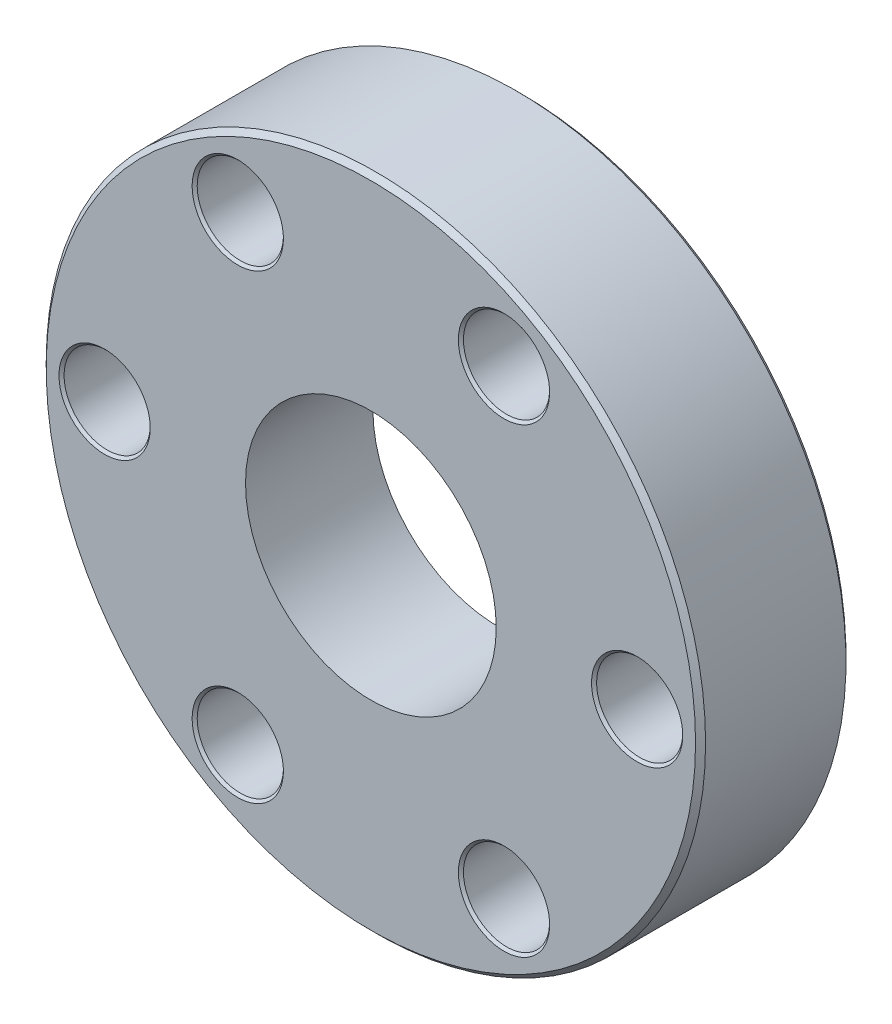
ISO-10303-21;
HEADER;
FILE_DESCRIPTION(('STEP AP214'),'2;1');
FILE_NAME('part.step','',(''),(''),'','','');
FILE_SCHEMA(('AUTOMOTIVE_DESIGN { 1 0 10303 214 1 1 1 1 }'));
ENDSEC;
DATA;
#1=APPLICATION_CONTEXT('core data for automotive mechanical design processes');
#2=APPLICATION_PROTOCOL_DEFINITION('international standard','automotive_design',2000,#1);
#3=PRODUCT_CONTEXT('',#1,'mechanical');
#4=PRODUCT('Part','Part','',(#3));
#5=PRODUCT_RELATED_PRODUCT_CATEGORY('part','',(#4));
#6=PRODUCT_DEFINITION_FORMATION('','',#4);
#7=PRODUCT_DEFINITION_CONTEXT('part definition',#1,'design');
#8=PRODUCT_DEFINITION('design','',#6,#7);
#9=PRODUCT_DEFINITION_SHAPE('','',#8);
#10=(LENGTH_UNIT() NAMED_UNIT(*) SI_UNIT(.MILLI.,.METRE.));
#11=(NAMED_UNIT(*) PLANE_ANGLE_UNIT() SI_UNIT($,.RADIAN.));
#12=(NAMED_UNIT(*) SI_UNIT($,.STERADIAN.) SOLID_ANGLE_UNIT());
#13=UNCERTAINTY_MEASURE_WITH_UNIT(LENGTH_MEASURE(1.E-05),#10,'distance_accuracy_value','');
#14=(GEOMETRIC_REPRESENTATION_CONTEXT(3) GLOBAL_UNCERTAINTY_ASSIGNED_CONTEXT((#13)) GLOBAL_UNIT_ASSIGNED_CONTEXT((#10,
#11,#12)) REPRESENTATION_CONTEXT('',''));
#15=CARTESIAN_POINT('',(0.,0.,0.));
#16=DIRECTION('',(0.,0.,1.));
#17=DIRECTION('',(1.,0.,0.));
#18=AXIS2_PLACEMENT_3D('',#15,#16,#17);
#19=CARTESIAN_POINT('',(0.,0.,0.));
#20=DIRECTION('',(0.,0.,-1.));
#21=DIRECTION('',(-1.,0.,0.));
#22=AXIS2_PLACEMENT_3D('',#19,#20,#21);
#23=CYLINDRICAL_SURFACE('',#22,16.7005);
#24=CARTESIAN_POINT('',(0.,0.,0.254000000000001));
#25=DIRECTION('',(0.,0.,-1.));
#26=DIRECTION('',(-1.,0.,0.));
#27=AXIS2_PLACEMENT_3D('',#24,#25,#26);
#28=CIRCLE('',#27,16.7005);
#29=CARTESIAN_POINT('',(-16.7005,0.,0.254000000000001));
#30=VERTEX_POINT('',#29);
#31=EDGE_CURVE('E37',#30,#30,#28,.F.);
#32=ORIENTED_EDGE('',*,*,#31,.T.);
#33=EDGE_LOOP('',(#32));
#34=FACE_BOUND('',#33,.T.);
#35=CARTESIAN_POINT('',(0.,0.,7.366));
#36=DIRECTION('',(0.,0.,1.));
#37=DIRECTION('',(1.,0.,0.));
#38=AXIS2_PLACEMENT_3D('',#35,#36,#37);
#39=CIRCLE('',#38,16.7005);
#40=CARTESIAN_POINT('',(16.7005,0.,7.366));
#41=VERTEX_POINT('',#40);
#42=EDGE_CURVE('E41',#41,#41,#39,.F.);
#43=ORIENTED_EDGE('',*,*,#42,.T.);
#44=EDGE_LOOP('',(#43));
#45=FACE_BOUND('',#44,.T.);
#46=ADVANCED_FACE('F30',(#34,#45),#23,.T.);
#47=CARTESIAN_POINT('',(0.,6.35,7.61999999999999));
#48=DIRECTION('',(0.,0.,1.));
#49=DIRECTION('',(1.,0.,0.));
#50=AXIS2_PLACEMENT_3D('',#47,#48,#49);
#51=PLANE('',#50);
#52=CARTESIAN_POINT('',(6.74370000000014,-11.6804310310022,7.62));
#53=DIRECTION('',(0.,0.,-1.));
#54=DIRECTION('',(-1.,0.,0.));
#55=AXIS2_PLACEMENT_3D('',#52,#53,#54);
#56=CIRCLE('',#55,2.3114);
#57=CARTESIAN_POINT('',(4.43230000000014,-11.6804310310022,7.62));
#58=VERTEX_POINT('',#57);
#59=EDGE_CURVE('E137',#58,#58,#56,.T.);
#60=ORIENTED_EDGE('',*,*,#59,.T.);
#61=EDGE_LOOP('',(#60));
#62=FACE_BOUND('',#61,.T.);
#63=CARTESIAN_POINT('',(-6.74369999999989,-11.6804310310023,7.62));
#64=DIRECTION('',(0.,0.,-1.));
#65=DIRECTION('',(-1.,0.,0.));
#66=AXIS2_PLACEMENT_3D('',#63,#64,#65);
#67=CIRCLE('',#66,2.3114);
#68=CARTESIAN_POINT('',(-9.05509999999989,-11.6804310310023,7.62));
#69=VERTEX_POINT('',#68);
#70=EDGE_CURVE('E125',#69,#69,#67,.T.);
#71=ORIENTED_EDGE('',*,*,#70,.T.);
#72=EDGE_LOOP('',(#71));
#73=FACE_BOUND('',#72,.T.);
#74=CARTESIAN_POINT('',(-13.4874,0.,7.62));
#75=DIRECTION('',(0.,0.,-1.));
#76=DIRECTION('',(-1.,0.,0.));
#77=AXIS2_PLACEMENT_3D('',#74,#75,#76);
#78=CIRCLE('',#77,2.3114);
#79=CARTESIAN_POINT('',(-15.7988,0.,7.62));
#80=VERTEX_POINT('',#79);
#81=EDGE_CURVE('E113',#80,#80,#78,.T.);
#82=ORIENTED_EDGE('',*,*,#81,.T.);
#83=EDGE_LOOP('',(#82));
#84=FACE_BOUND('',#83,.T.);
#85=CARTESIAN_POINT('',(-6.74370000000006,11.6804310310022,7.62));
#86=DIRECTION('',(0.,0.,-1.));
#87=DIRECTION('',(-1.,0.,0.));
#88=AXIS2_PLACEMENT_3D('',#85,#86,#87);
#89=CIRCLE('',#88,2.3114);
#90=CARTESIAN_POINT('',(-9.05510000000005,11.6804310310022,7.62));
#91=VERTEX_POINT('',#90);
#92=EDGE_CURVE('E101',#91,#91,#89,.T.);
#93=ORIENTED_EDGE('',*,*,#92,.T.);
#94=EDGE_LOOP('',(#93));
#95=FACE_BOUND('',#94,.T.);
#96=CARTESIAN_POINT('',(6.74369999999997,11.6804310310023,7.62));
#97=DIRECTION('',(0.,0.,-1.));
#98=DIRECTION('',(-1.,0.,0.));
#99=AXIS2_PLACEMENT_3D('',#96,#97,#98);
#100=CIRCLE('',#99,2.3114);
#101=CARTESIAN_POINT('',(4.43229999999997,11.6804310310023,7.62));
#102=VERTEX_POINT('',#101);
#103=EDGE_CURVE('E89',#102,#102,#100,.T.);
#104=ORIENTED_EDGE('',*,*,#103,.T.);
#105=EDGE_LOOP('',(#104));
#106=FACE_BOUND('',#105,.T.);
#107=CARTESIAN_POINT('',(13.4874,0.,7.62));
#108=DIRECTION('',(0.,0.,-1.));
#109=DIRECTION('',(-1.,0.,0.));
#110=AXIS2_PLACEMENT_3D('',#107,#108,#109);
#111=CIRCLE('',#110,2.3114);
#112=CARTESIAN_POINT('',(11.176,0.,7.62));
#113=VERTEX_POINT('',#112);
#114=EDGE_CURVE('E77',#113,#113,#111,.T.);
#115=ORIENTED_EDGE('',*,*,#114,.T.);
#116=EDGE_LOOP('',(#115));
#117=FACE_BOUND('',#116,.T.);
#118=CARTESIAN_POINT('',(0.,0.,7.61999999999999));
#119=DIRECTION('',(0.,0.,1.));
#120=DIRECTION('',(1.,0.,0.));
#121=AXIS2_PLACEMENT_3D('',#118,#119,#120);
#122=CIRCLE('',#121,16.4465);
#123=CARTESIAN_POINT('',(16.4465,0.,7.61999999999999));
#124=VERTEX_POINT('',#123);
#125=EDGE_CURVE('E10',#124,#124,#122,.T.);
#126=ORIENTED_EDGE('',*,*,#125,.T.);
#127=EDGE_LOOP('',(#126));
#128=FACE_BOUND('',#127,.T.);
#129=CARTESIAN_POINT('',(0.,0.,7.61999999999999));
#130=DIRECTION('',(0.,0.,-1.));
#131=DIRECTION('',(-1.,0.,0.));
#132=AXIS2_PLACEMENT_3D('',#129,#130,#131);
#133=CIRCLE('',#132,6.35);
#134=CARTESIAN_POINT('',(-6.35,0.,7.61999999999999));
#135=VERTEX_POINT('',#134);
#136=EDGE_CURVE('E50',#135,#135,#133,.T.);
#137=ORIENTED_EDGE('',*,*,#136,.T.);
#138=EDGE_LOOP('',(#137));
#139=FACE_BOUND('',#138,.T.);
#140=ADVANCED_FACE('F141',(#62,#73,#84,#95,#106,#117,#128,#139),#51,.T.);
#141=CARTESIAN_POINT('',(0.,0.,0.));
#142=DIRECTION('',(0.,0.,-1.));
#143=DIRECTION('',(-1.,0.,0.));
#144=AXIS2_PLACEMENT_3D('',#141,#142,#143);
#145=CYLINDRICAL_SURFACE('',#144,6.35);
#146=CARTESIAN_POINT('',(0.,0.,1.1684));
#147=DIRECTION('',(0.,0.,-1.));
#148=DIRECTION('',(-1.,0.,0.));
#149=AXIS2_PLACEMENT_3D('',#146,#147,#148);
#150=CIRCLE('',#149,6.35);
#151=CARTESIAN_POINT('',(-6.35,0.,1.1684));
#152=VERTEX_POINT('',#151);
#153=EDGE_CURVE('E53',#152,#152,#150,.T.);
#154=ORIENTED_EDGE('',*,*,#153,.T.);
#155=EDGE_LOOP('',(#154));
#156=FACE_BOUND('',#155,.T.);
#157=ORIENTED_EDGE('',*,*,#136,.F.);
#158=EDGE_LOOP('',(#157));
#159=FACE_BOUND('',#158,.T.);
#160=ADVANCED_FACE('F203',(#156,#159),#145,.F.);
#161=CARTESIAN_POINT('',(0.,9.017,1.1684));
#162=DIRECTION('',(0.,0.,-1.));
#163=DIRECTION('',(-1.,0.,0.));
#164=AXIS2_PLACEMENT_3D('',#161,#162,#163);
#165=PLANE('',#164);
#166=CARTESIAN_POINT('',(0.,0.,1.1684));
#167=DIRECTION('',(0.,0.,-1.));
#168=DIRECTION('',(-1.,0.,0.));
#169=AXIS2_PLACEMENT_3D('',#166,#167,#168);
#170=CIRCLE('',#169,9.017);
#171=CARTESIAN_POINT('',(-9.017,0.,1.1684));
#172=VERTEX_POINT('',#171);
#173=EDGE_CURVE('E56',#172,#172,#170,.T.);
#174=ORIENTED_EDGE('',*,*,#173,.T.);
#175=EDGE_LOOP('',(#174));
#176=FACE_BOUND('',#175,.T.);
#177=ORIENTED_EDGE('',*,*,#153,.F.);
#178=EDGE_LOOP('',(#177));
#179=FACE_BOUND('',#178,.T.);
#180=ADVANCED_FACE('F197',(#176,#179),#165,.T.);
#181=CARTESIAN_POINT('',(0.,0.,0.));
#182=DIRECTION('',(0.,0.,-1.));
#183=DIRECTION('',(-1.,0.,0.));
#184=AXIS2_PLACEMENT_3D('',#181,#182,#183);
#185=CYLINDRICAL_SURFACE('',#184,9.017);
#186=CARTESIAN_POINT('',(0.,0.,0.660399999999996));
#187=DIRECTION('',(0.,0.,-1.));
#188=DIRECTION('',(-1.,0.,0.));
#189=AXIS2_PLACEMENT_3D('',#186,#187,#188);
#190=CIRCLE('',#189,9.017);
#191=CARTESIAN_POINT('',(-9.017,0.,0.660399999999996));
#192=VERTEX_POINT('',#191);
#193=EDGE_CURVE('E59',#192,#192,#190,.T.);
#194=ORIENTED_EDGE('',*,*,#193,.T.);
#195=EDGE_LOOP('',(#194));
#196=FACE_BOUND('',#195,.T.);
#197=ORIENTED_EDGE('',*,*,#173,.F.);
#198=EDGE_LOOP('',(#197));
#199=FACE_BOUND('',#198,.T.);
#200=ADVANCED_FACE('F191',(#196,#199),#185,.F.);
#201=CARTESIAN_POINT('',(0.,0.,0.660399999999996));
#202=DIRECTION('',(0.,0.,1.));
#203=DIRECTION('',(1.,0.,0.));
#204=AXIS2_PLACEMENT_3D('',#201,#202,#203);
#205=CONICAL_SURFACE('',#204,9.017,1.39626340159546);
#206=CARTESIAN_POINT('',(0.,0.,0.973909371699648));
#207=DIRECTION('',(0.,0.,-1.));
#208=DIRECTION('',(-1.,0.,0.));
#209=AXIS2_PLACEMENT_3D('',#206,#207,#208);
#210=CIRCLE('',#209,10.795);
#211=CARTESIAN_POINT('',(-10.795,0.,0.973909371699648));
#212=VERTEX_POINT('',#211);
#213=EDGE_CURVE('E62',#212,#212,#210,.T.);
#214=ORIENTED_EDGE('',*,*,#213,.T.);
#215=EDGE_LOOP('',(#214));
#216=FACE_BOUND('',#215,.T.);
#217=ORIENTED_EDGE('',*,*,#193,.F.);
#218=EDGE_LOOP('',(#217));
#219=FACE_BOUND('',#218,.T.);
#220=ADVANCED_FACE('F185',(#216,#219),#205,.T.);
#221=CARTESIAN_POINT('',(0.,0.,0.));
#222=DIRECTION('',(0.,0.,-1.));
#223=DIRECTION('',(-1.,0.,0.));
#224=AXIS2_PLACEMENT_3D('',#221,#222,#223);
#225=CYLINDRICAL_SURFACE('',#224,10.795);
#226=CARTESIAN_POINT('',(0.,0.,0.));
#227=DIRECTION('',(0.,0.,-1.));
#228=DIRECTION('',(-1.,0.,0.));
#229=AXIS2_PLACEMENT_3D('',#226,#227,#228);
#230=CIRCLE('',#229,10.795);
#231=CARTESIAN_POINT('',(-10.795,0.,0.));
#232=VERTEX_POINT('',#231);
#233=EDGE_CURVE('E65',#232,#232,#230,.T.);
#234=ORIENTED_EDGE('',*,*,#233,.T.);
#235=EDGE_LOOP('',(#234));
#236=FACE_BOUND('',#235,.T.);
#237=ORIENTED_EDGE('',*,*,#213,.F.);
#238=EDGE_LOOP('',(#237));
#239=FACE_BOUND('',#238,.T.);
#240=ADVANCED_FACE('F167',(#236,#239),#225,.F.);
#241=CARTESIAN_POINT('',(0.,16.7005,0.));
#242=DIRECTION('',(0.,0.,-1.));
#243=DIRECTION('',(-1.,0.,0.));
#244=AXIS2_PLACEMENT_3D('',#241,#242,#243);
#245=PLANE('',#244);
#246=CARTESIAN_POINT('',(6.74370000000014,-11.6804310310022,0.));
#247=DIRECTION('',(0.,0.,-1.));
#248=DIRECTION('',(-1.,0.,0.));
#249=AXIS2_PLACEMENT_3D('',#246,#247,#248);
#250=CIRCLE('',#249,2.3114);
#251=CARTESIAN_POINT('',(4.43230000000014,-11.6804310310022,0.));
#252=VERTEX_POINT('',#251);
#253=EDGE_CURVE('E128',#252,#252,#250,.T.);
#254=ORIENTED_EDGE('',*,*,#253,.F.);
#255=EDGE_LOOP('',(#254));
#256=FACE_BOUND('',#255,.T.);
#257=CARTESIAN_POINT('',(-6.74369999999989,-11.6804310310023,0.));
#258=DIRECTION('',(0.,0.,-1.));
#259=DIRECTION('',(-1.,0.,0.));
#260=AXIS2_PLACEMENT_3D('',#257,#258,#259);
#261=CIRCLE('',#260,2.3114);
#262=CARTESIAN_POINT('',(-9.05509999999989,-11.6804310310023,0.));
#263=VERTEX_POINT('',#262);
#264=EDGE_CURVE('E116',#263,#263,#261,.T.);
#265=ORIENTED_EDGE('',*,*,#264,.F.);
#266=EDGE_LOOP('',(#265));
#267=FACE_BOUND('',#266,.T.);
#268=CARTESIAN_POINT('',(-13.4874,0.,0.));
#269=DIRECTION('',(0.,0.,-1.));
#270=DIRECTION('',(-1.,0.,0.));
#271=AXIS2_PLACEMENT_3D('',#268,#269,#270);
#272=CIRCLE('',#271,2.3114);
#273=CARTESIAN_POINT('',(-15.7988,0.,0.));
#274=VERTEX_POINT('',#273);
#275=EDGE_CURVE('E104',#274,#274,#272,.T.);
#276=ORIENTED_EDGE('',*,*,#275,.F.);
#277=EDGE_LOOP('',(#276));
#278=FACE_BOUND('',#277,.T.);
#279=CARTESIAN_POINT('',(-6.74370000000006,11.6804310310022,0.));
#280=DIRECTION('',(0.,0.,-1.));
#281=DIRECTION('',(-1.,0.,0.));
#282=AXIS2_PLACEMENT_3D('',#279,#280,#281);
#283=CIRCLE('',#282,2.3114);
#284=CARTESIAN_POINT('',(-9.05510000000006,11.6804310310022,0.));
#285=VERTEX_POINT('',#284);
#286=EDGE_CURVE('E92',#285,#285,#283,.T.);
#287=ORIENTED_EDGE('',*,*,#286,.F.);
#288=EDGE_LOOP('',(#287));
#289=FACE_BOUND('',#288,.T.);
#290=CARTESIAN_POINT('',(6.74369999999997,11.6804310310023,0.));
#291=DIRECTION('',(0.,0.,-1.));
#292=DIRECTION('',(-1.,0.,0.));
#293=AXIS2_PLACEMENT_3D('',#290,#291,#292);
#294=CIRCLE('',#293,2.3114);
#295=CARTESIAN_POINT('',(4.43229999999997,11.6804310310023,0.));
#296=VERTEX_POINT('',#295);
#297=EDGE_CURVE('E80',#296,#296,#294,.T.);
#298=ORIENTED_EDGE('',*,*,#297,.F.);
#299=EDGE_LOOP('',(#298));
#300=FACE_BOUND('',#299,.T.);
#301=CARTESIAN_POINT('',(13.4874,0.,0.));
#302=DIRECTION('',(0.,0.,-1.));
#303=DIRECTION('',(-1.,0.,0.));
#304=AXIS2_PLACEMENT_3D('',#301,#302,#303);
#305=CIRCLE('',#304,2.3114);
#306=CARTESIAN_POINT('',(11.176,0.,0.));
#307=VERTEX_POINT('',#306);
#308=EDGE_CURVE('E68',#307,#307,#305,.T.);
#309=ORIENTED_EDGE('',*,*,#308,.F.);
#310=EDGE_LOOP('',(#309));
#311=FACE_BOUND('',#310,.T.);
#312=CARTESIAN_POINT('',(0.,0.,0.));
#313=DIRECTION('',(0.,0.,-1.));
#314=DIRECTION('',(-1.,0.,0.));
#315=AXIS2_PLACEMENT_3D('',#312,#313,#314);
#316=CIRCLE('',#315,16.4465);
#317=CARTESIAN_POINT('',(-16.4465,0.,0.));
#318=VERTEX_POINT('',#317);
#319=EDGE_CURVE('E45',#318,#318,#316,.T.);
#320=ORIENTED_EDGE('',*,*,#319,.T.);
#321=EDGE_LOOP('',(#320));
#322=FACE_BOUND('',#321,.T.);
#323=ORIENTED_EDGE('',*,*,#233,.F.);
#324=EDGE_LOOP('',(#323));
#325=FACE_BOUND('',#324,.T.);
#326=ADVANCED_FACE('F163',(#256,#267,#278,#289,#300,#311,#322,#325),#245,.T.);
#327=CARTESIAN_POINT('',(0.,0.,0.));
#328=DIRECTION('',(0.,0.,1.));
#329=DIRECTION('',(1.,0.,0.));
#330=AXIS2_PLACEMENT_3D('',#327,#328,#329);
#331=CONICAL_SURFACE('',#330,16.4465,0.785398163397462);
#332=ORIENTED_EDGE('',*,*,#31,.F.);
#333=EDGE_LOOP('',(#332));
#334=FACE_BOUND('',#333,.T.);
#335=ORIENTED_EDGE('',*,*,#319,.F.);
#336=EDGE_LOOP('',(#335));
#337=FACE_BOUND('',#336,.T.);
#338=ADVANCED_FACE('F166',(#334,#337),#331,.T.);
#339=CARTESIAN_POINT('',(0.,0.,7.366));
#340=DIRECTION('',(0.,0.,-1.));
#341=DIRECTION('',(-1.,0.,0.));
#342=AXIS2_PLACEMENT_3D('',#339,#340,#341);
#343=CONICAL_SURFACE('',#342,16.7005,0.785398163397455);
#344=ORIENTED_EDGE('',*,*,#125,.F.);
#345=EDGE_LOOP('',(#344));
#346=FACE_BOUND('',#345,.T.);
#347=ORIENTED_EDGE('',*,*,#42,.F.);
#348=EDGE_LOOP('',(#347));
#349=FACE_BOUND('',#348,.T.);
#350=ADVANCED_FACE('F32',(#346,#349),#343,.T.);
#351=CARTESIAN_POINT('',(13.4874,0.,0.));
#352=DIRECTION('',(0.,0.,-1.));
#353=DIRECTION('',(-1.,0.,0.));
#354=AXIS2_PLACEMENT_3D('',#351,#352,#353);
#355=CONICAL_SURFACE('',#354,2.3114,0.785398163397458);
#356=CARTESIAN_POINT('',(13.4874,0.,0.128523999999999));
#357=DIRECTION('',(0.,0.,-1.));
#358=DIRECTION('',(-1.,0.,0.));
#359=AXIS2_PLACEMENT_3D('',#356,#357,#358);
#360=CIRCLE('',#359,2.182876);
#361=CARTESIAN_POINT('',(11.304524,0.,0.128523999999999));
#362=VERTEX_POINT('',#361);
#363=EDGE_CURVE('E71',#362,#362,#360,.T.);
#364=ORIENTED_EDGE('',*,*,#363,.F.);
#365=EDGE_LOOP('',(#364));
#366=FACE_BOUND('',#365,.T.);
#367=ORIENTED_EDGE('',*,*,#308,.T.);
#368=EDGE_LOOP('',(#367));
#369=FACE_BOUND('',#368,.T.);
#370=ADVANCED_FACE('F223',(#366,#369),#355,.F.);
#371=CARTESIAN_POINT('',(13.4874,0.,0.));
#372=DIRECTION('',(0.,0.,-1.));
#373=DIRECTION('',(-1.,0.,0.));
#374=AXIS2_PLACEMENT_3D('',#371,#372,#373);
#375=CYLINDRICAL_SURFACE('',#374,2.182876);
#376=CARTESIAN_POINT('',(13.4874,0.,7.491476));
#377=DIRECTION('',(0.,0.,-1.));
#378=DIRECTION('',(-1.,0.,0.));
#379=AXIS2_PLACEMENT_3D('',#376,#377,#378);
#380=CIRCLE('',#379,2.182876);
#381=CARTESIAN_POINT('',(11.304524,0.,7.491476));
#382=VERTEX_POINT('',#381);
#383=EDGE_CURVE('E74',#382,#382,#380,.T.);
#384=ORIENTED_EDGE('',*,*,#383,.F.);
#385=EDGE_LOOP('',(#384));
#386=FACE_BOUND('',#385,.T.);
#387=ORIENTED_EDGE('',*,*,#363,.T.);
#388=EDGE_LOOP('',(#387));
#389=FACE_BOUND('',#388,.T.);
#390=ADVANCED_FACE('F229',(#386,#389),#375,.F.);
#391=CARTESIAN_POINT('',(13.4874,0.,7.491476));
#392=DIRECTION('',(0.,0.,1.));
#393=DIRECTION('',(1.,0.,0.));
#394=AXIS2_PLACEMENT_3D('',#391,#392,#393);
#395=CONICAL_SURFACE('',#394,2.182876,0.785398163397445);
#396=ORIENTED_EDGE('',*,*,#114,.F.);
#397=EDGE_LOOP('',(#396));
#398=FACE_BOUND('',#397,.T.);
#399=ORIENTED_EDGE('',*,*,#383,.T.);
#400=EDGE_LOOP('',(#399));
#401=FACE_BOUND('',#400,.T.);
#402=ADVANCED_FACE('F238',(#398,#401),#395,.F.);
#403=CARTESIAN_POINT('',(6.74369999999997,11.6804310310023,0.));
#404=DIRECTION('',(0.,0.,-1.));
#405=DIRECTION('',(-1.,0.,0.));
#406=AXIS2_PLACEMENT_3D('',#403,#404,#405);
#407=CONICAL_SURFACE('',#406,2.3114,0.785398163397452);
#408=CARTESIAN_POINT('',(6.74369999999997,11.6804310310023,0.128523999999999));
#409=DIRECTION('',(0.,0.,-1.));
#410=DIRECTION('',(-1.,0.,0.));
#411=AXIS2_PLACEMENT_3D('',#408,#409,#410);
#412=CIRCLE('',#411,2.182876);
#413=CARTESIAN_POINT('',(4.56082399999997,11.6804310310023,0.128523999999999));
#414=VERTEX_POINT('',#413);
#415=EDGE_CURVE('E83',#414,#414,#412,.T.);
#416=ORIENTED_EDGE('',*,*,#415,.F.);
#417=EDGE_LOOP('',(#416));
#418=FACE_BOUND('',#417,.T.);
#419=ORIENTED_EDGE('',*,*,#297,.T.);
#420=EDGE_LOOP('',(#419));
#421=FACE_BOUND('',#420,.T.);
#422=ADVANCED_FACE('F246',(#418,#421),#407,.F.);
#423=CARTESIAN_POINT('',(6.74369999999997,11.6804310310023,0.));
#424=DIRECTION('',(0.,0.,-1.));
#425=DIRECTION('',(-1.,0.,0.));
#426=AXIS2_PLACEMENT_3D('',#423,#424,#425);
#427=CYLINDRICAL_SURFACE('',#426,2.182876);
#428=CARTESIAN_POINT('',(6.74369999999997,11.6804310310023,7.491476));
#429=DIRECTION('',(0.,0.,-1.));
#430=DIRECTION('',(-1.,0.,0.));
#431=AXIS2_PLACEMENT_3D('',#428,#429,#430);
#432=CIRCLE('',#431,2.182876);
#433=CARTESIAN_POINT('',(4.56082399999998,11.6804310310023,7.491476));
#434=VERTEX_POINT('',#433);
#435=EDGE_CURVE('E86',#434,#434,#432,.T.);
#436=ORIENTED_EDGE('',*,*,#435,.F.);
#437=EDGE_LOOP('',(#436));
#438=FACE_BOUND('',#437,.T.);
#439=ORIENTED_EDGE('',*,*,#415,.T.);
#440=EDGE_LOOP('',(#439));
#441=FACE_BOUND('',#440,.T.);
#442=ADVANCED_FACE('F250',(#438,#441),#427,.F.);
#443=CARTESIAN_POINT('',(6.74369999999997,11.6804310310023,7.491476));
#444=DIRECTION('',(0.,0.,1.));
#445=DIRECTION('',(1.,0.,0.));
#446=AXIS2_PLACEMENT_3D('',#443,#444,#445);
#447=CONICAL_SURFACE('',#446,2.182876,0.785398163397445);
#448=ORIENTED_EDGE('',*,*,#103,.F.);
#449=EDGE_LOOP('',(#448));
#450=FACE_BOUND('',#449,.T.);
#451=ORIENTED_EDGE('',*,*,#435,.T.);
#452=EDGE_LOOP('',(#451));
#453=FACE_BOUND('',#452,.T.);
#454=ADVANCED_FACE('F254',(#450,#453),#447,.F.);
#455=CARTESIAN_POINT('',(-6.74370000000006,11.6804310310022,0.));
#456=DIRECTION('',(0.,0.,-1.));
#457=DIRECTION('',(-1.,0.,0.));
#458=AXIS2_PLACEMENT_3D('',#455,#456,#457);
#459=CONICAL_SURFACE('',#458,2.3114,0.785398163397458);
#460=CARTESIAN_POINT('',(-6.74370000000006,11.6804310310022,0.128523999999999));
#461=DIRECTION('',(0.,0.,-1.));
#462=DIRECTION('',(-1.,0.,0.));
#463=AXIS2_PLACEMENT_3D('',#460,#461,#462);
#464=CIRCLE('',#463,2.182876);
#465=CARTESIAN_POINT('',(-8.92657600000005,11.6804310310022,0.128523999999999));
#466=VERTEX_POINT('',#465);
#467=EDGE_CURVE('E95',#466,#466,#464,.T.);
#468=ORIENTED_EDGE('',*,*,#467,.F.);
#469=EDGE_LOOP('',(#468));
#470=FACE_BOUND('',#469,.T.);
#471=ORIENTED_EDGE('',*,*,#286,.T.);
#472=EDGE_LOOP('',(#471));
#473=FACE_BOUND('',#472,.T.);
#474=ADVANCED_FACE('F258',(#470,#473),#459,.F.);
#475=CARTESIAN_POINT('',(-6.74370000000006,11.6804310310022,0.));
#476=DIRECTION('',(0.,0.,-1.));
#477=DIRECTION('',(-1.,0.,0.));
#478=AXIS2_PLACEMENT_3D('',#475,#476,#477);
#479=CYLINDRICAL_SURFACE('',#478,2.182876);
#480=CARTESIAN_POINT('',(-6.74370000000006,11.6804310310022,7.491476));
#481=DIRECTION('',(0.,0.,-1.));
#482=DIRECTION('',(-1.,0.,0.));
#483=AXIS2_PLACEMENT_3D('',#480,#481,#482);
#484=CIRCLE('',#483,2.182876);
#485=CARTESIAN_POINT('',(-8.92657600000005,11.6804310310022,7.491476));
#486=VERTEX_POINT('',#485);
#487=EDGE_CURVE('E98',#486,#486,#484,.T.);
#488=ORIENTED_EDGE('',*,*,#487,.F.);
#489=EDGE_LOOP('',(#488));
#490=FACE_BOUND('',#489,.T.);
#491=ORIENTED_EDGE('',*,*,#467,.T.);
#492=EDGE_LOOP('',(#491));
#493=FACE_BOUND('',#492,.T.);
#494=ADVANCED_FACE('F262',(#490,#493),#479,.F.);
#495=CARTESIAN_POINT('',(-6.74370000000006,11.6804310310022,7.491476));
#496=DIRECTION('',(0.,0.,1.));
#497=DIRECTION('',(1.,0.,0.));
#498=AXIS2_PLACEMENT_3D('',#495,#496,#497);
#499=CONICAL_SURFACE('',#498,2.182876,0.785398163397438);
#500=ORIENTED_EDGE('',*,*,#92,.F.);
#501=EDGE_LOOP('',(#500));
#502=FACE_BOUND('',#501,.T.);
#503=ORIENTED_EDGE('',*,*,#487,.T.);
#504=EDGE_LOOP('',(#503));
#505=FACE_BOUND('',#504,.T.);
#506=ADVANCED_FACE('F266',(#502,#505),#499,.F.);
#507=CARTESIAN_POINT('',(-13.4874,0.,0.));
#508=DIRECTION('',(0.,0.,-1.));
#509=DIRECTION('',(-1.,0.,0.));
#510=AXIS2_PLACEMENT_3D('',#507,#508,#509);
#511=CONICAL_SURFACE('',#510,2.3114,0.785398163397458);
#512=CARTESIAN_POINT('',(-13.4874,0.,0.128523999999999));
#513=DIRECTION('',(0.,0.,-1.));
#514=DIRECTION('',(-1.,0.,0.));
#515=AXIS2_PLACEMENT_3D('',#512,#513,#514);
#516=CIRCLE('',#515,2.182876);
#517=CARTESIAN_POINT('',(-15.670276,0.,0.128523999999999));
#518=VERTEX_POINT('',#517);
#519=EDGE_CURVE('E107',#518,#518,#516,.T.);
#520=ORIENTED_EDGE('',*,*,#519,.F.);
#521=EDGE_LOOP('',(#520));
#522=FACE_BOUND('',#521,.T.);
#523=ORIENTED_EDGE('',*,*,#275,.T.);
#524=EDGE_LOOP('',(#523));
#525=FACE_BOUND('',#524,.T.);
#526=ADVANCED_FACE('F270',(#522,#525),#511,.F.);
#527=CARTESIAN_POINT('',(-13.4874,0.,0.));
#528=DIRECTION('',(0.,0.,-1.));
#529=DIRECTION('',(-1.,0.,0.));
#530=AXIS2_PLACEMENT_3D('',#527,#528,#529);
#531=CYLINDRICAL_SURFACE('',#530,2.182876);
#532=CARTESIAN_POINT('',(-13.4874,0.,7.491476));
#533=DIRECTION('',(0.,0.,-1.));
#534=DIRECTION('',(-1.,0.,0.));
#535=AXIS2_PLACEMENT_3D('',#532,#533,#534);
#536=CIRCLE('',#535,2.182876);
#537=CARTESIAN_POINT('',(-15.670276,0.,7.491476));
#538=VERTEX_POINT('',#537);
#539=EDGE_CURVE('E110',#538,#538,#536,.T.);
#540=ORIENTED_EDGE('',*,*,#539,.F.);
#541=EDGE_LOOP('',(#540));
#542=FACE_BOUND('',#541,.T.);
#543=ORIENTED_EDGE('',*,*,#519,.T.);
#544=EDGE_LOOP('',(#543));
#545=FACE_BOUND('',#544,.T.);
#546=ADVANCED_FACE('F274',(#542,#545),#531,.F.);
#547=CARTESIAN_POINT('',(-13.4874,0.,7.491476));
#548=DIRECTION('',(0.,0.,1.));
#549=DIRECTION('',(1.,0.,0.));
#550=AXIS2_PLACEMENT_3D('',#547,#548,#549);
#551=CONICAL_SURFACE('',#550,2.182876,0.785398163397438);
#552=ORIENTED_EDGE('',*,*,#81,.F.);
#553=EDGE_LOOP('',(#552));
#554=FACE_BOUND('',#553,.T.);
#555=ORIENTED_EDGE('',*,*,#539,.T.);
#556=EDGE_LOOP('',(#555));
#557=FACE_BOUND('',#556,.T.);
#558=ADVANCED_FACE('F278',(#554,#557),#551,.F.);
#559=CARTESIAN_POINT('',(-6.74369999999989,-11.6804310310023,0.));
#560=DIRECTION('',(0.,0.,-1.));
#561=DIRECTION('',(-1.,0.,0.));
#562=AXIS2_PLACEMENT_3D('',#559,#560,#561);
#563=CONICAL_SURFACE('',#562,2.3114,0.785398163397455);
#564=CARTESIAN_POINT('',(-6.74369999999989,-11.6804310310023,0.128523999999999));
#565=DIRECTION('',(0.,0.,-1.));
#566=DIRECTION('',(-1.,0.,0.));
#567=AXIS2_PLACEMENT_3D('',#564,#565,#566);
#568=CIRCLE('',#567,2.182876);
#569=CARTESIAN_POINT('',(-8.92657599999989,-11.6804310310023,0.128523999999999));
#570=VERTEX_POINT('',#569);
#571=EDGE_CURVE('E119',#570,#570,#568,.T.);
#572=ORIENTED_EDGE('',*,*,#571,.F.);
#573=EDGE_LOOP('',(#572));
#574=FACE_BOUND('',#573,.T.);
#575=ORIENTED_EDGE('',*,*,#264,.T.);
#576=EDGE_LOOP('',(#575));
#577=FACE_BOUND('',#576,.T.);
#578=ADVANCED_FACE('F282',(#574,#577),#563,.F.);
#579=CARTESIAN_POINT('',(-6.74369999999989,-11.6804310310023,0.));
#580=DIRECTION('',(0.,0.,-1.));
#581=DIRECTION('',(-1.,0.,0.));
#582=AXIS2_PLACEMENT_3D('',#579,#580,#581);
#583=CYLINDRICAL_SURFACE('',#582,2.182876);
#584=CARTESIAN_POINT('',(-6.74369999999989,-11.6804310310023,7.491476));
#585=DIRECTION('',(0.,0.,-1.));
#586=DIRECTION('',(-1.,0.,0.));
#587=AXIS2_PLACEMENT_3D('',#584,#585,#586);
#588=CIRCLE('',#587,2.182876);
#589=CARTESIAN_POINT('',(-8.92657599999989,-11.6804310310023,7.491476));
#590=VERTEX_POINT('',#589);
#591=EDGE_CURVE('E122',#590,#590,#588,.T.);
#592=ORIENTED_EDGE('',*,*,#591,.F.);
#593=EDGE_LOOP('',(#592));
#594=FACE_BOUND('',#593,.T.);
#595=ORIENTED_EDGE('',*,*,#571,.T.);
#596=EDGE_LOOP('',(#595));
#597=FACE_BOUND('',#596,.T.);
#598=ADVANCED_FACE('F286',(#594,#597),#583,.F.);
#599=CARTESIAN_POINT('',(-6.74369999999989,-11.6804310310023,7.491476));
#600=DIRECTION('',(0.,0.,1.));
#601=DIRECTION('',(1.,0.,0.));
#602=AXIS2_PLACEMENT_3D('',#599,#600,#601);
#603=CONICAL_SURFACE('',#602,2.182876,0.785398163397442);
#604=ORIENTED_EDGE('',*,*,#70,.F.);
#605=EDGE_LOOP('',(#604));
#606=FACE_BOUND('',#605,.T.);
#607=ORIENTED_EDGE('',*,*,#591,.T.);
#608=EDGE_LOOP('',(#607));
#609=FACE_BOUND('',#608,.T.);
#610=ADVANCED_FACE('F159',(#606,#609),#603,.F.);
#611=CARTESIAN_POINT('',(6.74370000000014,-11.6804310310022,0.));
#612=DIRECTION('',(0.,0.,-1.));
#613=DIRECTION('',(-1.,0.,0.));
#614=AXIS2_PLACEMENT_3D('',#611,#612,#613);
#615=CONICAL_SURFACE('',#614,2.3114,0.785398163397452);
#616=CARTESIAN_POINT('',(6.74370000000014,-11.6804310310022,0.128523999999999));
#617=DIRECTION('',(0.,0.,-1.));
#618=DIRECTION('',(-1.,0.,0.));
#619=AXIS2_PLACEMENT_3D('',#616,#617,#618);
#620=CIRCLE('',#619,2.182876);
#621=CARTESIAN_POINT('',(4.56082400000014,-11.6804310310022,0.128523999999999));
#622=VERTEX_POINT('',#621);
#623=EDGE_CURVE('E131',#622,#622,#620,.T.);
#624=ORIENTED_EDGE('',*,*,#623,.F.);
#625=EDGE_LOOP('',(#624));
#626=FACE_BOUND('',#625,.T.);
#627=ORIENTED_EDGE('',*,*,#253,.T.);
#628=EDGE_LOOP('',(#627));
#629=FACE_BOUND('',#628,.T.);
#630=ADVANCED_FACE('F153',(#626,#629),#615,.F.);
#631=CARTESIAN_POINT('',(6.74370000000014,-11.6804310310022,0.));
#632=DIRECTION('',(0.,0.,-1.));
#633=DIRECTION('',(-1.,0.,0.));
#634=AXIS2_PLACEMENT_3D('',#631,#632,#633);
#635=CYLINDRICAL_SURFACE('',#634,2.182876);
#636=CARTESIAN_POINT('',(6.74370000000014,-11.6804310310022,7.491476));
#637=DIRECTION('',(0.,0.,-1.));
#638=DIRECTION('',(-1.,0.,0.));
#639=AXIS2_PLACEMENT_3D('',#636,#637,#638);
#640=CIRCLE('',#639,2.182876);
#641=CARTESIAN_POINT('',(4.56082400000014,-11.6804310310022,7.491476));
#642=VERTEX_POINT('',#641);
#643=EDGE_CURVE('E134',#642,#642,#640,.T.);
#644=ORIENTED_EDGE('',*,*,#643,.F.);
#645=EDGE_LOOP('',(#644));
#646=FACE_BOUND('',#645,.T.);
#647=ORIENTED_EDGE('',*,*,#623,.T.);
#648=EDGE_LOOP('',(#647));
#649=FACE_BOUND('',#648,.T.);
#650=ADVANCED_FACE('F147',(#646,#649),#635,.F.);
#651=CARTESIAN_POINT('',(6.74370000000014,-11.6804310310022,7.491476));
#652=DIRECTION('',(0.,0.,1.));
#653=DIRECTION('',(1.,0.,0.));
#654=AXIS2_PLACEMENT_3D('',#651,#652,#653);
#655=CONICAL_SURFACE('',#654,2.182876,0.785398163397445);
#656=ORIENTED_EDGE('',*,*,#59,.F.);
#657=EDGE_LOOP('',(#656));
#658=FACE_BOUND('',#657,.T.);
#659=ORIENTED_EDGE('',*,*,#643,.T.);
#660=EDGE_LOOP('',(#659));
#661=FACE_BOUND('',#660,.T.);
#662=ADVANCED_FACE('F144',(#658,#661),#655,.F.);
#663=CLOSED_SHELL('',(#46,#140,#160,#180,#200,#220,#240,#326,#338,#350,#370,#390,#402,#422,#442,
#454,#474,#494,#506,#526,#546,#558,#578,#598,#610,#630,#650,#662));
#664=MANIFOLD_SOLID_BREP('B2',#663);
#665=ADVANCED_BREP_SHAPE_REPRESENTATION('',(#18,#664),#14);
#666=SHAPE_DEFINITION_REPRESENTATION(#9,#665);
ENDSEC;
END-ISO-10303-21;
